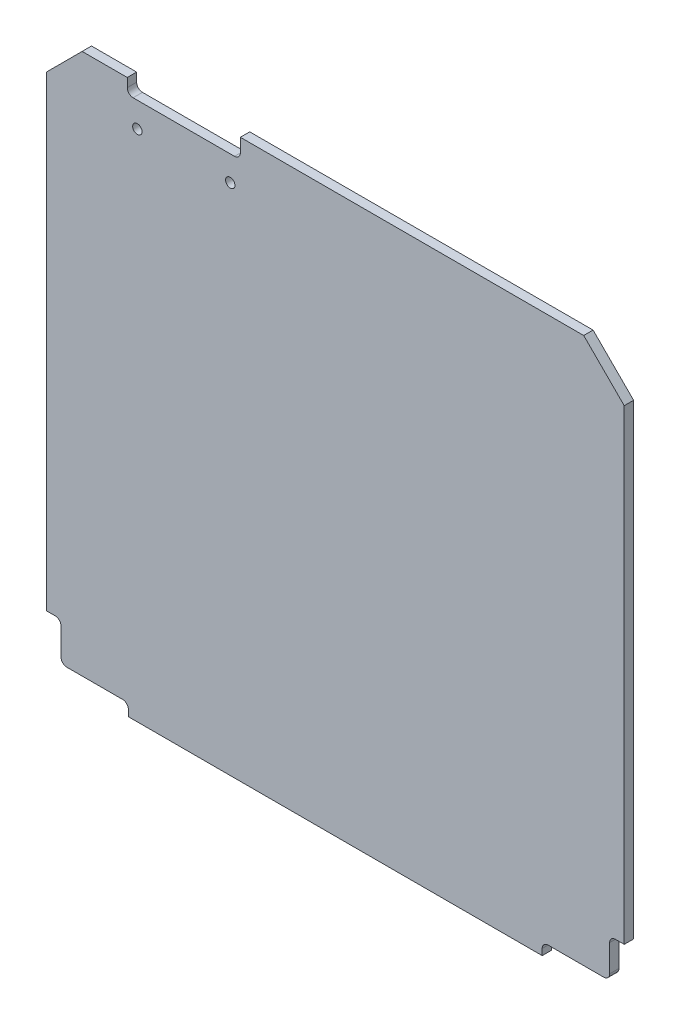
ISO-10303-21;
HEADER;
FILE_DESCRIPTION(('STEP AP214'),'2;1');
FILE_NAME('part.step','',(''),(''),'','','');
FILE_SCHEMA(('AUTOMOTIVE_DESIGN { 1 0 10303 214 1 1 1 1 }'));
ENDSEC;
DATA;
#1=APPLICATION_CONTEXT('core data for automotive mechanical design processes');
#2=APPLICATION_PROTOCOL_DEFINITION('international standard','automotive_design',2000,#1);
#3=PRODUCT_CONTEXT('',#1,'mechanical');
#4=PRODUCT('Part','Part','',(#3));
#5=PRODUCT_RELATED_PRODUCT_CATEGORY('part','',(#4));
#6=PRODUCT_DEFINITION_FORMATION('','',#4);
#7=PRODUCT_DEFINITION_CONTEXT('part definition',#1,'design');
#8=PRODUCT_DEFINITION('design','',#6,#7);
#9=PRODUCT_DEFINITION_SHAPE('','',#8);
#10=(LENGTH_UNIT() NAMED_UNIT(*) SI_UNIT(.MILLI.,.METRE.));
#11=(NAMED_UNIT(*) PLANE_ANGLE_UNIT() SI_UNIT($,.RADIAN.));
#12=(NAMED_UNIT(*) SI_UNIT($,.STERADIAN.) SOLID_ANGLE_UNIT());
#13=UNCERTAINTY_MEASURE_WITH_UNIT(LENGTH_MEASURE(1.E-05),#10,'distance_accuracy_value','');
#14=(GEOMETRIC_REPRESENTATION_CONTEXT(3) GLOBAL_UNCERTAINTY_ASSIGNED_CONTEXT((#13)) GLOBAL_UNIT_ASSIGNED_CONTEXT((#10,
#11,#12)) REPRESENTATION_CONTEXT('',''));
#15=CARTESIAN_POINT('',(0.,0.,0.));
#16=DIRECTION('',(0.,0.,1.));
#17=DIRECTION('',(1.,0.,0.));
#18=AXIS2_PLACEMENT_3D('',#15,#16,#17);
#19=CARTESIAN_POINT('',(-36.3,-48.0000000000001,-0.0125000000000027));
#20=DIRECTION('',(0.,0.,1.));
#21=DIRECTION('',(1.,0.,0.));
#22=AXIS2_PLACEMENT_3D('',#19,#20,#21);
#23=CYLINDRICAL_SURFACE('',#22,1.00000000000001);
#24=CARTESIAN_POINT('',(-36.3,-48.0000000000001,1.5875));
#25=DIRECTION('',(0.,0.,-1.));
#26=DIRECTION('',(-1.,0.,0.));
#27=AXIS2_PLACEMENT_3D('',#24,#25,#26);
#28=CIRCLE('',#27,1.00000000000001);
#29=CARTESIAN_POINT('',(-36.3,-47.0000000000001,1.5875));
#30=VERTEX_POINT('',#29);
#31=CARTESIAN_POINT('',(-35.3,-48.0000000000001,1.5875));
#32=VERTEX_POINT('',#31);
#33=EDGE_CURVE('E238',#30,#32,#28,.T.);
#34=ORIENTED_EDGE('',*,*,#33,.F.);
#35=DIRECTION('',(0.,0.,1.));
#36=VECTOR('',#35,1.);
#37=CARTESIAN_POINT('',(-36.3,-47.0000000000001,-0.0125000000000027));
#38=LINE('',#37,#36);
#39=CARTESIAN_POINT('',(-36.3,-47.0000000000001,-0.0125000000000027));
#40=VERTEX_POINT('',#39);
#41=EDGE_CURVE('E11',#40,#30,#38,.T.);
#42=ORIENTED_EDGE('',*,*,#41,.F.);
#43=CARTESIAN_POINT('',(-36.3,-48.0000000000001,-0.0125000000000027));
#44=DIRECTION('',(0.,0.,-1.));
#45=DIRECTION('',(-1.,0.,0.));
#46=AXIS2_PLACEMENT_3D('',#43,#44,#45);
#47=CIRCLE('',#46,1.00000000000001);
#48=CARTESIAN_POINT('',(-35.3,-48.0000000000001,-0.0125000000000027));
#49=VERTEX_POINT('',#48);
#50=EDGE_CURVE('E313',#40,#49,#47,.T.);
#51=ORIENTED_EDGE('',*,*,#50,.T.);
#52=DIRECTION('',(0.,0.,1.));
#53=VECTOR('',#52,1.);
#54=CARTESIAN_POINT('',(-35.3,-48.0000000000001,-0.0125000000000027));
#55=LINE('',#54,#53);
#56=EDGE_CURVE('E36',#49,#32,#55,.T.);
#57=ORIENTED_EDGE('',*,*,#56,.T.);
#58=EDGE_LOOP('',(#34,#42,#51,#57));
#59=FACE_BOUND('',#58,.T.);
#60=ADVANCED_FACE('F33',(#59),#23,.F.);
#61=CARTESIAN_POINT('',(-45.7999999999992,-47.,-0.0125000000000027));
#62=DIRECTION('',(0.,-1.,0.));
#63=DIRECTION('',(1.,0.,0.));
#64=AXIS2_PLACEMENT_3D('',#61,#62,#63);
#65=PLANE('',#64);
#66=DIRECTION('',(1.,0.,0.));
#67=VECTOR('',#66,1.);
#68=CARTESIAN_POINT('',(-45.7999999999992,-47.,1.5875));
#69=LINE('',#68,#67);
#70=CARTESIAN_POINT('',(-45.7999999999992,-47.,1.5875));
#71=VERTEX_POINT('',#70);
#72=EDGE_CURVE('E311',#71,#30,#69,.T.);
#73=ORIENTED_EDGE('',*,*,#72,.F.);
#74=DIRECTION('',(0.,0.,1.));
#75=VECTOR('',#74,1.);
#76=CARTESIAN_POINT('',(-45.7999999999992,-47.,-0.0125000000000027));
#77=LINE('',#76,#75);
#78=CARTESIAN_POINT('',(-45.7999999999992,-47.,-0.0125000000000027));
#79=VERTEX_POINT('',#78);
#80=EDGE_CURVE('E42',#79,#71,#77,.T.);
#81=ORIENTED_EDGE('',*,*,#80,.F.);
#82=DIRECTION('',(1.,0.,0.));
#83=VECTOR('',#82,1.);
#84=CARTESIAN_POINT('',(-45.7999999999992,-47.,-0.0125000000000027));
#85=LINE('',#84,#83);
#86=EDGE_CURVE('E228',#79,#40,#85,.T.);
#87=ORIENTED_EDGE('',*,*,#86,.T.);
#88=ORIENTED_EDGE('',*,*,#41,.T.);
#89=EDGE_LOOP('',(#73,#81,#87,#88));
#90=FACE_BOUND('',#89,.T.);
#91=ADVANCED_FACE('F361',(#90),#65,.T.);
#92=CARTESIAN_POINT('',(-45.7999999999992,-46.0000000000001,-0.0125000000000027));
#93=DIRECTION('',(0.,0.,1.));
#94=DIRECTION('',(1.,0.,0.));
#95=AXIS2_PLACEMENT_3D('',#92,#93,#94);
#96=CYLINDRICAL_SURFACE('',#95,0.999999999999959);
#97=CARTESIAN_POINT('',(-45.7999999999992,-46.0000000000001,1.5875));
#98=DIRECTION('',(0.,0.,1.));
#99=DIRECTION('',(1.,0.,0.));
#100=AXIS2_PLACEMENT_3D('',#97,#98,#99);
#101=CIRCLE('',#100,0.999999999999959);
#102=CARTESIAN_POINT('',(-46.7999999999992,-46.0000000000001,1.5875));
#103=VERTEX_POINT('',#102);
#104=EDGE_CURVE('E215',#103,#71,#101,.T.);
#105=ORIENTED_EDGE('',*,*,#104,.F.);
#106=DIRECTION('',(0.,0.,1.));
#107=VECTOR('',#106,1.);
#108=CARTESIAN_POINT('',(-46.7999999999992,-46.0000000000001,-0.0125000000000027));
#109=LINE('',#108,#107);
#110=CARTESIAN_POINT('',(-46.7999999999992,-46.0000000000001,-0.0125000000000027));
#111=VERTEX_POINT('',#110);
#112=EDGE_CURVE('E210',#111,#103,#109,.T.);
#113=ORIENTED_EDGE('',*,*,#112,.F.);
#114=CARTESIAN_POINT('',(-45.7999999999992,-46.0000000000001,-0.0125000000000027));
#115=DIRECTION('',(0.,0.,1.));
#116=DIRECTION('',(1.,0.,0.));
#117=AXIS2_PLACEMENT_3D('',#114,#115,#116);
#118=CIRCLE('',#117,0.999999999999959);
#119=EDGE_CURVE('E213',#111,#79,#118,.T.);
#120=ORIENTED_EDGE('',*,*,#119,.T.);
#121=ORIENTED_EDGE('',*,*,#80,.T.);
#122=EDGE_LOOP('',(#105,#113,#120,#121));
#123=FACE_BOUND('',#122,.T.);
#124=ADVANCED_FACE('F212',(#123),#96,.T.);
#125=CARTESIAN_POINT('',(-46.7999999999992,-41.400000000001,-0.0125000000000027));
#126=DIRECTION('',(-1.,0.,0.));
#127=DIRECTION('',(0.,0.,1.));
#128=AXIS2_PLACEMENT_3D('',#125,#126,#127);
#129=PLANE('',#128);
#130=DIRECTION('',(0.,-1.,0.));
#131=VECTOR('',#130,1.);
#132=CARTESIAN_POINT('',(-46.7999999999992,-41.400000000001,1.5875));
#133=LINE('',#132,#131);
#134=CARTESIAN_POINT('',(-46.7999999999992,-41.400000000001,1.5875));
#135=VERTEX_POINT('',#134);
#136=EDGE_CURVE('E308',#135,#103,#133,.T.);
#137=ORIENTED_EDGE('',*,*,#136,.F.);
#138=DIRECTION('',(0.,0.,1.));
#139=VECTOR('',#138,1.);
#140=CARTESIAN_POINT('',(-46.7999999999992,-41.400000000001,-0.0125000000000027));
#141=LINE('',#140,#139);
#142=CARTESIAN_POINT('',(-46.7999999999992,-41.400000000001,-0.0125000000000027));
#143=VERTEX_POINT('',#142);
#144=EDGE_CURVE('E220',#143,#135,#141,.T.);
#145=ORIENTED_EDGE('',*,*,#144,.F.);
#146=DIRECTION('',(0.,-1.,0.));
#147=VECTOR('',#146,1.);
#148=CARTESIAN_POINT('',(-46.7999999999992,-41.400000000001,-0.0125000000000027));
#149=LINE('',#148,#147);
#150=EDGE_CURVE('E226',#143,#111,#149,.T.);
#151=ORIENTED_EDGE('',*,*,#150,.T.);
#152=ORIENTED_EDGE('',*,*,#112,.T.);
#153=EDGE_LOOP('',(#137,#145,#151,#152));
#154=FACE_BOUND('',#153,.T.);
#155=ADVANCED_FACE('F230',(#154),#129,.T.);
#156=CARTESIAN_POINT('',(-47.7999999999992,-41.400000000001,-0.0125000000000027));
#157=DIRECTION('',(0.,0.,1.));
#158=DIRECTION('',(1.,0.,0.));
#159=AXIS2_PLACEMENT_3D('',#156,#157,#158);
#160=CYLINDRICAL_SURFACE('',#159,0.999999999999997);
#161=CARTESIAN_POINT('',(-47.7999999999992,-41.400000000001,1.5875));
#162=DIRECTION('',(0.,0.,-1.));
#163=DIRECTION('',(-1.,0.,0.));
#164=AXIS2_PLACEMENT_3D('',#161,#162,#163);
#165=CIRCLE('',#164,0.999999999999997);
#166=CARTESIAN_POINT('',(-47.7999999999992,-40.400000000001,1.5875));
#167=VERTEX_POINT('',#166);
#168=EDGE_CURVE('E305',#167,#135,#165,.T.);
#169=ORIENTED_EDGE('',*,*,#168,.F.);
#170=DIRECTION('',(0.,0.,1.));
#171=VECTOR('',#170,1.);
#172=CARTESIAN_POINT('',(-47.7999999999992,-40.400000000001,-0.0125000000000027));
#173=LINE('',#172,#171);
#174=CARTESIAN_POINT('',(-47.7999999999992,-40.400000000001,-0.0125000000000027));
#175=VERTEX_POINT('',#174);
#176=EDGE_CURVE('E317',#175,#167,#173,.T.);
#177=ORIENTED_EDGE('',*,*,#176,.F.);
#178=CARTESIAN_POINT('',(-47.7999999999992,-41.400000000001,-0.0125000000000027));
#179=DIRECTION('',(0.,0.,-1.));
#180=DIRECTION('',(-1.,0.,0.));
#181=AXIS2_PLACEMENT_3D('',#178,#179,#180);
#182=CIRCLE('',#181,0.999999999999997);
#183=EDGE_CURVE('E231',#175,#143,#182,.T.);
#184=ORIENTED_EDGE('',*,*,#183,.T.);
#185=ORIENTED_EDGE('',*,*,#144,.T.);
#186=EDGE_LOOP('',(#169,#177,#184,#185));
#187=FACE_BOUND('',#186,.T.);
#188=ADVANCED_FACE('F374',(#187),#160,.F.);
#189=CARTESIAN_POINT('',(-49.3000000000002,-40.400000000001,-0.0125000000000027));
#190=DIRECTION('',(0.,-1.,0.));
#191=DIRECTION('',(1.,0.,0.));
#192=AXIS2_PLACEMENT_3D('',#189,#190,#191);
#193=PLANE('',#192);
#194=DIRECTION('',(1.,0.,0.));
#195=VECTOR('',#194,1.);
#196=CARTESIAN_POINT('',(-49.3000000000002,-40.400000000001,1.5875));
#197=LINE('',#196,#195);
#198=CARTESIAN_POINT('',(-49.3000000000002,-40.400000000001,1.5875));
#199=VERTEX_POINT('',#198);
#200=EDGE_CURVE('E302',#199,#167,#197,.T.);
#201=ORIENTED_EDGE('',*,*,#200,.F.);
#202=DIRECTION('',(0.,0.,1.));
#203=VECTOR('',#202,1.);
#204=CARTESIAN_POINT('',(-49.3000000000002,-40.400000000001,-0.0125000000000027));
#205=LINE('',#204,#203);
#206=CARTESIAN_POINT('',(-49.3000000000002,-40.400000000001,-0.0125000000000027));
#207=VERTEX_POINT('',#206);
#208=EDGE_CURVE('E319',#207,#199,#205,.T.);
#209=ORIENTED_EDGE('',*,*,#208,.F.);
#210=DIRECTION('',(1.,0.,0.));
#211=VECTOR('',#210,1.);
#212=CARTESIAN_POINT('',(-49.3000000000002,-40.400000000001,-0.0125000000000027));
#213=LINE('',#212,#211);
#214=EDGE_CURVE('E233',#207,#175,#213,.T.);
#215=ORIENTED_EDGE('',*,*,#214,.T.);
#216=ORIENTED_EDGE('',*,*,#176,.T.);
#217=EDGE_LOOP('',(#201,#209,#215,#216));
#218=FACE_BOUND('',#217,.T.);
#219=ADVANCED_FACE('F377',(#218),#193,.T.);
#220=CARTESIAN_POINT('',(-49.3,39.2000000000024,-0.0125000000000027));
#221=DIRECTION('',(-1.,0.,0.));
#222=DIRECTION('',(0.,-1.,0.));
#223=AXIS2_PLACEMENT_3D('',#220,#221,#222);
#224=PLANE('',#223);
#225=DIRECTION('',(0.,-1.,0.));
#226=VECTOR('',#225,1.);
#227=CARTESIAN_POINT('',(-49.3,39.2000000000024,1.5875));
#228=LINE('',#227,#226);
#229=CARTESIAN_POINT('',(-49.3,39.2000000000024,1.5875));
#230=VERTEX_POINT('',#229);
#231=EDGE_CURVE('E299',#230,#199,#228,.T.);
#232=ORIENTED_EDGE('',*,*,#231,.F.);
#233=DIRECTION('',(0.,0.,1.));
#234=VECTOR('',#233,1.);
#235=CARTESIAN_POINT('',(-49.3,39.2000000000024,-0.0125000000000027));
#236=LINE('',#235,#234);
#237=CARTESIAN_POINT('',(-49.3,39.2000000000024,-0.0125000000000027));
#238=VERTEX_POINT('',#237);
#239=EDGE_CURVE('E321',#238,#230,#236,.T.);
#240=ORIENTED_EDGE('',*,*,#239,.F.);
#241=DIRECTION('',(0.,-1.,0.));
#242=VECTOR('',#241,1.);
#243=CARTESIAN_POINT('',(-49.3,39.2000000000024,-0.0125000000000027));
#244=LINE('',#243,#242);
#245=EDGE_CURVE('E549',#238,#207,#244,.T.);
#246=ORIENTED_EDGE('',*,*,#245,.T.);
#247=ORIENTED_EDGE('',*,*,#208,.T.);
#248=EDGE_LOOP('',(#232,#240,#246,#247));
#249=FACE_BOUND('',#248,.T.);
#250=ADVANCED_FACE('F381',(#249),#224,.T.);
#251=CARTESIAN_POINT('',(-43.2000000000015,45.3000000000009,-0.0125000000000027));
#252=DIRECTION('',(-0.707106781186551,0.707106781186544,0.));
#253=DIRECTION('',(-0.707106781186544,-0.707106781186551,0.));
#254=AXIS2_PLACEMENT_3D('',#251,#252,#253);
#255=PLANE('',#254);
#256=DIRECTION('',(-0.707106781186544,-0.707106781186551,0.));
#257=VECTOR('',#256,1.);
#258=CARTESIAN_POINT('',(-43.2000000000015,45.3000000000009,1.5875));
#259=LINE('',#258,#257);
#260=CARTESIAN_POINT('',(-43.2000000000015,45.3000000000009,1.5875));
#261=VERTEX_POINT('',#260);
#262=EDGE_CURVE('E296',#261,#230,#259,.T.);
#263=ORIENTED_EDGE('',*,*,#262,.F.);
#264=DIRECTION('',(0.,0.,1.));
#265=VECTOR('',#264,1.);
#266=CARTESIAN_POINT('',(-43.2000000000015,45.3000000000009,-0.0125000000000027));
#267=LINE('',#266,#265);
#268=CARTESIAN_POINT('',(-43.2000000000015,45.3000000000009,-0.0125000000000027));
#269=VERTEX_POINT('',#268);
#270=EDGE_CURVE('E323',#269,#261,#267,.T.);
#271=ORIENTED_EDGE('',*,*,#270,.F.);
#272=DIRECTION('',(-0.707106781186544,-0.707106781186551,0.));
#273=VECTOR('',#272,1.);
#274=CARTESIAN_POINT('',(-43.2000000000015,45.3000000000009,-0.0125000000000027));
#275=LINE('',#274,#273);
#276=EDGE_CURVE('E546',#269,#238,#275,.T.);
#277=ORIENTED_EDGE('',*,*,#276,.T.);
#278=ORIENTED_EDGE('',*,*,#239,.T.);
#279=EDGE_LOOP('',(#263,#271,#277,#278));
#280=FACE_BOUND('',#279,.T.);
#281=ADVANCED_FACE('F385',(#280),#255,.T.);
#282=CARTESIAN_POINT('',(-35.5000000173737,45.3000000000009,-0.0125000000000027));
#283=DIRECTION('',(0.,1.,0.));
#284=DIRECTION('',(0.,0.,1.));
#285=AXIS2_PLACEMENT_3D('',#282,#283,#284);
#286=PLANE('',#285);
#287=DIRECTION('',(-1.,0.,0.));
#288=VECTOR('',#287,1.);
#289=CARTESIAN_POINT('',(-35.5000000173737,45.3000000000009,1.5875));
#290=LINE('',#289,#288);
#291=CARTESIAN_POINT('',(-35.5000000173737,45.3000000000009,1.5875));
#292=VERTEX_POINT('',#291);
#293=EDGE_CURVE('E293',#292,#261,#290,.T.);
#294=ORIENTED_EDGE('',*,*,#293,.F.);
#295=DIRECTION('',(0.,0.,1.));
#296=VECTOR('',#295,1.);
#297=CARTESIAN_POINT('',(-35.5000000173737,45.3000000000009,-0.0125000000000027));
#298=LINE('',#297,#296);
#299=CARTESIAN_POINT('',(-35.5000000173737,45.3000000000009,-0.0125000000000027));
#300=VERTEX_POINT('',#299);
#301=EDGE_CURVE('E325',#300,#292,#298,.T.);
#302=ORIENTED_EDGE('',*,*,#301,.F.);
#303=DIRECTION('',(-1.,0.,0.));
#304=VECTOR('',#303,1.);
#305=CARTESIAN_POINT('',(-35.5000000173737,45.3000000000009,-0.0125000000000027));
#306=LINE('',#305,#304);
#307=EDGE_CURVE('E543',#300,#269,#306,.T.);
#308=ORIENTED_EDGE('',*,*,#307,.T.);
#309=ORIENTED_EDGE('',*,*,#270,.T.);
#310=EDGE_LOOP('',(#294,#302,#308,#309));
#311=FACE_BOUND('',#310,.T.);
#312=ADVANCED_FACE('F389',(#311),#286,.T.);
#313=CARTESIAN_POINT('',(-35.5000000173737,43.8000000000008,-0.0125000000000027));
#314=DIRECTION('',(1.,0.,0.));
#315=DIRECTION('',(0.,1.,0.));
#316=AXIS2_PLACEMENT_3D('',#313,#314,#315);
#317=PLANE('',#316);
#318=DIRECTION('',(0.,1.,0.));
#319=VECTOR('',#318,1.);
#320=CARTESIAN_POINT('',(-35.5000000173737,43.8000000000008,1.5875));
#321=LINE('',#320,#319);
#322=CARTESIAN_POINT('',(-35.5000000173737,43.8000000000008,1.5875));
#323=VERTEX_POINT('',#322);
#324=EDGE_CURVE('E290',#323,#292,#321,.T.);
#325=ORIENTED_EDGE('',*,*,#324,.F.);
#326=DIRECTION('',(0.,0.,1.));
#327=VECTOR('',#326,1.);
#328=CARTESIAN_POINT('',(-35.5000000173737,43.8000000000008,-0.0125000000000027));
#329=LINE('',#328,#327);
#330=CARTESIAN_POINT('',(-35.5000000173737,43.8000000000008,-0.0125000000000027));
#331=VERTEX_POINT('',#330);
#332=EDGE_CURVE('E327',#331,#323,#329,.T.);
#333=ORIENTED_EDGE('',*,*,#332,.F.);
#334=DIRECTION('',(0.,1.,0.));
#335=VECTOR('',#334,1.);
#336=CARTESIAN_POINT('',(-35.5000000173737,43.8000000000008,-0.0125000000000027));
#337=LINE('',#336,#335);
#338=EDGE_CURVE('E540',#331,#300,#337,.T.);
#339=ORIENTED_EDGE('',*,*,#338,.T.);
#340=ORIENTED_EDGE('',*,*,#301,.T.);
#341=EDGE_LOOP('',(#325,#333,#339,#340));
#342=FACE_BOUND('',#341,.T.);
#343=ADVANCED_FACE('F393',(#342),#317,.T.);
#344=CARTESIAN_POINT('',(-34.5000000173737,43.8000000000008,-0.0125000000000027));
#345=DIRECTION('',(0.,0.,1.));
#346=DIRECTION('',(1.,0.,0.));
#347=AXIS2_PLACEMENT_3D('',#344,#345,#346);
#348=CYLINDRICAL_SURFACE('',#347,0.999999999999984);
#349=CARTESIAN_POINT('',(-34.5000000173737,43.8000000000008,1.5875));
#350=DIRECTION('',(0.,0.,-1.));
#351=DIRECTION('',(-1.,0.,0.));
#352=AXIS2_PLACEMENT_3D('',#349,#350,#351);
#353=CIRCLE('',#352,0.999999999999984);
#354=CARTESIAN_POINT('',(-34.5000000173737,42.8000000000008,1.5875));
#355=VERTEX_POINT('',#354);
#356=EDGE_CURVE('E287',#355,#323,#353,.T.);
#357=ORIENTED_EDGE('',*,*,#356,.F.);
#358=DIRECTION('',(0.,0.,1.));
#359=VECTOR('',#358,1.);
#360=CARTESIAN_POINT('',(-34.5000000173737,42.8000000000008,-0.0125000000000027));
#361=LINE('',#360,#359);
#362=CARTESIAN_POINT('',(-34.5000000173737,42.8000000000008,-0.0125000000000027));
#363=VERTEX_POINT('',#362);
#364=EDGE_CURVE('E329',#363,#355,#361,.T.);
#365=ORIENTED_EDGE('',*,*,#364,.F.);
#366=CARTESIAN_POINT('',(-34.5000000173737,43.8000000000008,-0.0125000000000027));
#367=DIRECTION('',(0.,0.,-1.));
#368=DIRECTION('',(-1.,0.,0.));
#369=AXIS2_PLACEMENT_3D('',#366,#367,#368);
#370=CIRCLE('',#369,0.999999999999984);
#371=EDGE_CURVE('E537',#363,#331,#370,.T.);
#372=ORIENTED_EDGE('',*,*,#371,.T.);
#373=ORIENTED_EDGE('',*,*,#332,.T.);
#374=EDGE_LOOP('',(#357,#365,#372,#373));
#375=FACE_BOUND('',#374,.T.);
#376=ADVANCED_FACE('F397',(#375),#348,.F.);
#377=CARTESIAN_POINT('',(-17.2000000086743,42.8000000000008,-0.0125000000000027));
#378=DIRECTION('',(0.,1.,0.));
#379=DIRECTION('',(-1.,0.,0.));
#380=AXIS2_PLACEMENT_3D('',#377,#378,#379);
#381=PLANE('',#380);
#382=DIRECTION('',(-1.,0.,0.));
#383=VECTOR('',#382,1.);
#384=CARTESIAN_POINT('',(-17.2000000086743,42.8000000000008,1.5875));
#385=LINE('',#384,#383);
#386=CARTESIAN_POINT('',(-17.2000000086743,42.8000000000008,1.5875));
#387=VERTEX_POINT('',#386);
#388=EDGE_CURVE('E284',#387,#355,#385,.T.);
#389=ORIENTED_EDGE('',*,*,#388,.F.);
#390=DIRECTION('',(0.,0.,1.));
#391=VECTOR('',#390,1.);
#392=CARTESIAN_POINT('',(-17.2000000086743,42.8000000000008,-0.0125000000000027));
#393=LINE('',#392,#391);
#394=CARTESIAN_POINT('',(-17.2000000086743,42.8000000000008,-0.0125000000000027));
#395=VERTEX_POINT('',#394);
#396=EDGE_CURVE('E331',#395,#387,#393,.T.);
#397=ORIENTED_EDGE('',*,*,#396,.F.);
#398=DIRECTION('',(-1.,0.,0.));
#399=VECTOR('',#398,1.);
#400=CARTESIAN_POINT('',(-17.2000000086743,42.8000000000008,-0.0125000000000027));
#401=LINE('',#400,#399);
#402=EDGE_CURVE('E534',#395,#363,#401,.T.);
#403=ORIENTED_EDGE('',*,*,#402,.T.);
#404=ORIENTED_EDGE('',*,*,#364,.T.);
#405=EDGE_LOOP('',(#389,#397,#403,#404));
#406=FACE_BOUND('',#405,.T.);
#407=ADVANCED_FACE('F401',(#406),#381,.T.);
#408=CARTESIAN_POINT('',(-17.2000000086743,43.8000000000008,-0.0125000000000027));
#409=DIRECTION('',(0.,0.,1.));
#410=DIRECTION('',(1.,0.,0.));
#411=AXIS2_PLACEMENT_3D('',#408,#409,#410);
#412=CYLINDRICAL_SURFACE('',#411,0.999999999999992);
#413=CARTESIAN_POINT('',(-17.2000000086743,43.8000000000008,1.5875));
#414=DIRECTION('',(0.,0.,-1.));
#415=DIRECTION('',(-1.,0.,0.));
#416=AXIS2_PLACEMENT_3D('',#413,#414,#415);
#417=CIRCLE('',#416,0.999999999999992);
#418=CARTESIAN_POINT('',(-16.2000000086743,43.8000000000008,1.5875));
#419=VERTEX_POINT('',#418);
#420=EDGE_CURVE('E281',#419,#387,#417,.T.);
#421=ORIENTED_EDGE('',*,*,#420,.F.);
#422=DIRECTION('',(0.,0.,1.));
#423=VECTOR('',#422,1.);
#424=CARTESIAN_POINT('',(-16.2000000086743,43.8000000000008,-0.0125000000000027));
#425=LINE('',#424,#423);
#426=CARTESIAN_POINT('',(-16.2000000086743,43.8000000000008,-0.0125000000000027));
#427=VERTEX_POINT('',#426);
#428=EDGE_CURVE('E333',#427,#419,#425,.T.);
#429=ORIENTED_EDGE('',*,*,#428,.F.);
#430=CARTESIAN_POINT('',(-17.2000000086743,43.8000000000008,-0.0125000000000027));
#431=DIRECTION('',(0.,0.,-1.));
#432=DIRECTION('',(-1.,0.,0.));
#433=AXIS2_PLACEMENT_3D('',#430,#431,#432);
#434=CIRCLE('',#433,0.999999999999992);
#435=EDGE_CURVE('E531',#427,#395,#434,.T.);
#436=ORIENTED_EDGE('',*,*,#435,.T.);
#437=ORIENTED_EDGE('',*,*,#396,.T.);
#438=EDGE_LOOP('',(#421,#429,#436,#437));
#439=FACE_BOUND('',#438,.T.);
#440=ADVANCED_FACE('F405',(#439),#412,.F.);
#441=CARTESIAN_POINT('',(-16.2000000086743,46.1149999999993,-0.0125000000000027));
#442=DIRECTION('',(-1.,0.,0.));
#443=DIRECTION('',(0.,-1.,0.));
#444=AXIS2_PLACEMENT_3D('',#441,#442,#443);
#445=PLANE('',#444);
#446=DIRECTION('',(0.,-1.,0.));
#447=VECTOR('',#446,1.);
#448=CARTESIAN_POINT('',(-16.2000000086743,46.1149999999993,1.5875));
#449=LINE('',#448,#447);
#450=CARTESIAN_POINT('',(-16.2000000086743,46.1149999999993,1.5875));
#451=VERTEX_POINT('',#450);
#452=EDGE_CURVE('E278',#451,#419,#449,.T.);
#453=ORIENTED_EDGE('',*,*,#452,.F.);
#454=DIRECTION('',(0.,0.,1.));
#455=VECTOR('',#454,1.);
#456=CARTESIAN_POINT('',(-16.2000000086743,46.1149999999993,-0.0125000000000027));
#457=LINE('',#456,#455);
#458=CARTESIAN_POINT('',(-16.2000000086743,46.1149999999993,-0.0125000000000027));
#459=VERTEX_POINT('',#458);
#460=EDGE_CURVE('E335',#459,#451,#457,.T.);
#461=ORIENTED_EDGE('',*,*,#460,.F.);
#462=DIRECTION('',(0.,-1.,0.));
#463=VECTOR('',#462,1.);
#464=CARTESIAN_POINT('',(-16.2000000086743,46.1149999999993,-0.0125000000000027));
#465=LINE('',#464,#463);
#466=EDGE_CURVE('E528',#459,#427,#465,.T.);
#467=ORIENTED_EDGE('',*,*,#466,.T.);
#468=ORIENTED_EDGE('',*,*,#428,.T.);
#469=EDGE_LOOP('',(#453,#461,#467,#468));
#470=FACE_BOUND('',#469,.T.);
#471=ADVANCED_FACE('F409',(#470),#445,.T.);
#472=CARTESIAN_POINT('',(42.3850000000029,46.1149999999991,-0.0125000000000027));
#473=DIRECTION('',(0.,1.,0.));
#474=DIRECTION('',(-1.,0.,0.));
#475=AXIS2_PLACEMENT_3D('',#472,#473,#474);
#476=PLANE('',#475);
#477=DIRECTION('',(-1.,0.,0.));
#478=VECTOR('',#477,1.);
#479=CARTESIAN_POINT('',(42.3850000000029,46.1149999999991,1.5875));
#480=LINE('',#479,#478);
#481=CARTESIAN_POINT('',(42.3850000000029,46.1149999999991,1.5875));
#482=VERTEX_POINT('',#481);
#483=EDGE_CURVE('E275',#482,#451,#480,.T.);
#484=ORIENTED_EDGE('',*,*,#483,.F.);
#485=DIRECTION('',(0.,0.,1.));
#486=VECTOR('',#485,1.);
#487=CARTESIAN_POINT('',(42.3850000000029,46.1149999999991,-0.0125000000000027));
#488=LINE('',#487,#486);
#489=CARTESIAN_POINT('',(42.3850000000029,46.1149999999991,-0.0125000000000027));
#490=VERTEX_POINT('',#489);
#491=EDGE_CURVE('E337',#490,#482,#488,.T.);
#492=ORIENTED_EDGE('',*,*,#491,.F.);
#493=DIRECTION('',(-1.,0.,0.));
#494=VECTOR('',#493,1.);
#495=CARTESIAN_POINT('',(42.3850000000029,46.1149999999991,-0.0125000000000027));
#496=LINE('',#495,#494);
#497=EDGE_CURVE('E525',#490,#459,#496,.T.);
#498=ORIENTED_EDGE('',*,*,#497,.T.);
#499=ORIENTED_EDGE('',*,*,#460,.T.);
#500=EDGE_LOOP('',(#484,#492,#498,#499));
#501=FACE_BOUND('',#500,.T.);
#502=ADVANCED_FACE('F413',(#501),#476,.T.);
#503=CARTESIAN_POINT('',(49.3,39.200000000002,-0.0125000000000027));
#504=DIRECTION('',(0.707106781186547,0.707106781186547,0.));
#505=DIRECTION('',(-0.707106781186548,0.707106781186548,0.));
#506=AXIS2_PLACEMENT_3D('',#503,#504,#505);
#507=PLANE('',#506);
#508=DIRECTION('',(-0.707106781186548,0.707106781186548,0.));
#509=VECTOR('',#508,1.);
#510=CARTESIAN_POINT('',(49.3,39.200000000002,1.5875));
#511=LINE('',#510,#509);
#512=CARTESIAN_POINT('',(49.3,39.200000000002,1.5875));
#513=VERTEX_POINT('',#512);
#514=EDGE_CURVE('E272',#513,#482,#511,.T.);
#515=ORIENTED_EDGE('',*,*,#514,.F.);
#516=DIRECTION('',(0.,0.,1.));
#517=VECTOR('',#516,1.);
#518=CARTESIAN_POINT('',(49.3,39.200000000002,-0.0125000000000027));
#519=LINE('',#518,#517);
#520=CARTESIAN_POINT('',(49.3,39.200000000002,-0.0125000000000027));
#521=VERTEX_POINT('',#520);
#522=EDGE_CURVE('E339',#521,#513,#519,.T.);
#523=ORIENTED_EDGE('',*,*,#522,.F.);
#524=DIRECTION('',(-0.707106781186548,0.707106781186548,0.));
#525=VECTOR('',#524,1.);
#526=CARTESIAN_POINT('',(49.3,39.200000000002,-0.0125000000000027));
#527=LINE('',#526,#525);
#528=EDGE_CURVE('E522',#521,#490,#527,.T.);
#529=ORIENTED_EDGE('',*,*,#528,.T.);
#530=ORIENTED_EDGE('',*,*,#491,.T.);
#531=EDGE_LOOP('',(#515,#523,#529,#530));
#532=FACE_BOUND('',#531,.T.);
#533=ADVANCED_FACE('F417',(#532),#507,.T.);
#534=CARTESIAN_POINT('',(49.3,-40.400000000001,-0.0125000000000027));
#535=DIRECTION('',(1.,0.,0.));
#536=DIRECTION('',(0.,1.,0.));
#537=AXIS2_PLACEMENT_3D('',#534,#535,#536);
#538=PLANE('',#537);
#539=DIRECTION('',(0.,1.,0.));
#540=VECTOR('',#539,1.);
#541=CARTESIAN_POINT('',(49.3,-40.400000000001,1.5875));
#542=LINE('',#541,#540);
#543=CARTESIAN_POINT('',(49.3,-40.400000000001,1.5875));
#544=VERTEX_POINT('',#543);
#545=EDGE_CURVE('E269',#544,#513,#542,.T.);
#546=ORIENTED_EDGE('',*,*,#545,.F.);
#547=DIRECTION('',(0.,0.,1.));
#548=VECTOR('',#547,1.);
#549=CARTESIAN_POINT('',(49.3,-40.400000000001,-0.0125000000000027));
#550=LINE('',#549,#548);
#551=CARTESIAN_POINT('',(49.3,-40.400000000001,-0.0125000000000027));
#552=VERTEX_POINT('',#551);
#553=EDGE_CURVE('E341',#552,#544,#550,.T.);
#554=ORIENTED_EDGE('',*,*,#553,.F.);
#555=DIRECTION('',(0.,1.,0.));
#556=VECTOR('',#555,1.);
#557=CARTESIAN_POINT('',(49.3,-40.400000000001,-0.0125000000000027));
#558=LINE('',#557,#556);
#559=EDGE_CURVE('E519',#552,#521,#558,.T.);
#560=ORIENTED_EDGE('',*,*,#559,.T.);
#561=ORIENTED_EDGE('',*,*,#522,.T.);
#562=EDGE_LOOP('',(#546,#554,#560,#561));
#563=FACE_BOUND('',#562,.T.);
#564=ADVANCED_FACE('F421',(#563),#538,.T.);
#565=CARTESIAN_POINT('',(47.7999999999989,-40.400000000001,-0.0125000000000027));
#566=DIRECTION('',(0.,-1.,0.));
#567=DIRECTION('',(0.,0.,-1.));
#568=AXIS2_PLACEMENT_3D('',#565,#566,#567);
#569=PLANE('',#568);
#570=DIRECTION('',(1.,0.,0.));
#571=VECTOR('',#570,1.);
#572=CARTESIAN_POINT('',(47.7999999999989,-40.400000000001,1.5875));
#573=LINE('',#572,#571);
#574=CARTESIAN_POINT('',(47.7999999999989,-40.400000000001,1.5875));
#575=VERTEX_POINT('',#574);
#576=EDGE_CURVE('E266',#575,#544,#573,.T.);
#577=ORIENTED_EDGE('',*,*,#576,.F.);
#578=DIRECTION('',(0.,0.,1.));
#579=VECTOR('',#578,1.);
#580=CARTESIAN_POINT('',(47.7999999999989,-40.400000000001,-0.0125000000000027));
#581=LINE('',#580,#579);
#582=CARTESIAN_POINT('',(47.7999999999989,-40.400000000001,-0.0125000000000027));
#583=VERTEX_POINT('',#582);
#584=EDGE_CURVE('E343',#583,#575,#581,.T.);
#585=ORIENTED_EDGE('',*,*,#584,.F.);
#586=DIRECTION('',(1.,0.,0.));
#587=VECTOR('',#586,1.);
#588=CARTESIAN_POINT('',(47.7999999999989,-40.400000000001,-0.0125000000000027));
#589=LINE('',#588,#587);
#590=EDGE_CURVE('E516',#583,#552,#589,.T.);
#591=ORIENTED_EDGE('',*,*,#590,.T.);
#592=ORIENTED_EDGE('',*,*,#553,.T.);
#593=EDGE_LOOP('',(#577,#585,#591,#592));
#594=FACE_BOUND('',#593,.T.);
#595=ADVANCED_FACE('F425',(#594),#569,.T.);
#596=CARTESIAN_POINT('',(47.7999999999989,-41.400000000001,-0.0125000000000027));
#597=DIRECTION('',(0.,0.,1.));
#598=DIRECTION('',(1.,0.,0.));
#599=AXIS2_PLACEMENT_3D('',#596,#597,#598);
#600=CYLINDRICAL_SURFACE('',#599,0.999999999999997);
#601=CARTESIAN_POINT('',(47.7999999999989,-41.400000000001,1.5875));
#602=DIRECTION('',(0.,0.,-1.));
#603=DIRECTION('',(-1.,0.,0.));
#604=AXIS2_PLACEMENT_3D('',#601,#602,#603);
#605=CIRCLE('',#604,0.999999999999997);
#606=CARTESIAN_POINT('',(46.7999999999989,-41.400000000001,1.5875));
#607=VERTEX_POINT('',#606);
#608=EDGE_CURVE('E263',#607,#575,#605,.T.);
#609=ORIENTED_EDGE('',*,*,#608,.F.);
#610=DIRECTION('',(0.,0.,1.));
#611=VECTOR('',#610,1.);
#612=CARTESIAN_POINT('',(46.7999999999989,-41.400000000001,-0.0125000000000027));
#613=LINE('',#612,#611);
#614=CARTESIAN_POINT('',(46.7999999999989,-41.400000000001,-0.0125000000000027));
#615=VERTEX_POINT('',#614);
#616=EDGE_CURVE('E345',#615,#607,#613,.T.);
#617=ORIENTED_EDGE('',*,*,#616,.F.);
#618=CARTESIAN_POINT('',(47.7999999999989,-41.400000000001,-0.0125000000000027));
#619=DIRECTION('',(0.,0.,-1.));
#620=DIRECTION('',(-1.,0.,0.));
#621=AXIS2_PLACEMENT_3D('',#618,#619,#620);
#622=CIRCLE('',#621,0.999999999999997);
#623=EDGE_CURVE('E513',#615,#583,#622,.T.);
#624=ORIENTED_EDGE('',*,*,#623,.T.);
#625=ORIENTED_EDGE('',*,*,#584,.T.);
#626=EDGE_LOOP('',(#609,#617,#624,#625));
#627=FACE_BOUND('',#626,.T.);
#628=ADVANCED_FACE('F429',(#627),#600,.F.);
#629=CARTESIAN_POINT('',(46.7999999999989,-46.0000000000001,-0.0125000000000027));
#630=DIRECTION('',(1.,0.,0.));
#631=DIRECTION('',(0.,0.,-1.));
#632=AXIS2_PLACEMENT_3D('',#629,#630,#631);
#633=PLANE('',#632);
#634=DIRECTION('',(0.,1.,0.));
#635=VECTOR('',#634,1.);
#636=CARTESIAN_POINT('',(46.7999999999989,-46.0000000000001,1.5875));
#637=LINE('',#636,#635);
#638=CARTESIAN_POINT('',(46.7999999999989,-46.0000000000001,1.5875));
#639=VERTEX_POINT('',#638);
#640=EDGE_CURVE('E260',#639,#607,#637,.T.);
#641=ORIENTED_EDGE('',*,*,#640,.F.);
#642=DIRECTION('',(0.,0.,1.));
#643=VECTOR('',#642,1.);
#644=CARTESIAN_POINT('',(46.7999999999989,-46.0000000000001,-0.0125000000000027));
#645=LINE('',#644,#643);
#646=CARTESIAN_POINT('',(46.7999999999989,-46.0000000000001,-0.0125000000000027));
#647=VERTEX_POINT('',#646);
#648=EDGE_CURVE('E347',#647,#639,#645,.T.);
#649=ORIENTED_EDGE('',*,*,#648,.F.);
#650=DIRECTION('',(0.,1.,0.));
#651=VECTOR('',#650,1.);
#652=CARTESIAN_POINT('',(46.7999999999989,-46.0000000000001,-0.0125000000000027));
#653=LINE('',#652,#651);
#654=EDGE_CURVE('E510',#647,#615,#653,.T.);
#655=ORIENTED_EDGE('',*,*,#654,.T.);
#656=ORIENTED_EDGE('',*,*,#616,.T.);
#657=EDGE_LOOP('',(#641,#649,#655,#656));
#658=FACE_BOUND('',#657,.T.);
#659=ADVANCED_FACE('F433',(#658),#633,.T.);
#660=CARTESIAN_POINT('',(45.7999999999989,-46.0000000000001,-0.0125000000000027));
#661=DIRECTION('',(0.,0.,1.));
#662=DIRECTION('',(1.,0.,0.));
#663=AXIS2_PLACEMENT_3D('',#660,#661,#662);
#664=CYLINDRICAL_SURFACE('',#663,0.999999999999994);
#665=CARTESIAN_POINT('',(45.7999999999989,-46.0000000000001,1.5875));
#666=DIRECTION('',(0.,0.,1.));
#667=DIRECTION('',(1.,0.,0.));
#668=AXIS2_PLACEMENT_3D('',#665,#666,#667);
#669=CIRCLE('',#668,0.999999999999994);
#670=CARTESIAN_POINT('',(45.7999999999989,-47.0000000000001,1.5875));
#671=VERTEX_POINT('',#670);
#672=EDGE_CURVE('E257',#671,#639,#669,.T.);
#673=ORIENTED_EDGE('',*,*,#672,.F.);
#674=DIRECTION('',(0.,0.,1.));
#675=VECTOR('',#674,1.);
#676=CARTESIAN_POINT('',(45.7999999999989,-47.0000000000001,-0.0125000000000027));
#677=LINE('',#676,#675);
#678=CARTESIAN_POINT('',(45.7999999999989,-47.0000000000001,-0.0125000000000027));
#679=VERTEX_POINT('',#678);
#680=EDGE_CURVE('E349',#679,#671,#677,.T.);
#681=ORIENTED_EDGE('',*,*,#680,.F.);
#682=CARTESIAN_POINT('',(45.7999999999989,-46.0000000000001,-0.0125000000000027));
#683=DIRECTION('',(0.,0.,1.));
#684=DIRECTION('',(1.,0.,0.));
#685=AXIS2_PLACEMENT_3D('',#682,#683,#684);
#686=CIRCLE('',#685,0.999999999999994);
#687=EDGE_CURVE('E507',#679,#647,#686,.T.);
#688=ORIENTED_EDGE('',*,*,#687,.T.);
#689=ORIENTED_EDGE('',*,*,#648,.T.);
#690=EDGE_LOOP('',(#673,#681,#688,#689));
#691=FACE_BOUND('',#690,.T.);
#692=ADVANCED_FACE('F437',(#691),#664,.T.);
#693=CARTESIAN_POINT('',(36.3,-47.0000000000001,-0.0125000000000027));
#694=DIRECTION('',(0.,-1.,0.));
#695=DIRECTION('',(1.,0.,0.));
#696=AXIS2_PLACEMENT_3D('',#693,#694,#695);
#697=PLANE('',#696);
#698=DIRECTION('',(1.,0.,0.));
#699=VECTOR('',#698,1.);
#700=CARTESIAN_POINT('',(36.3,-47.0000000000001,1.5875));
#701=LINE('',#700,#699);
#702=CARTESIAN_POINT('',(36.3,-47.0000000000001,1.5875));
#703=VERTEX_POINT('',#702);
#704=EDGE_CURVE('E254',#703,#671,#701,.T.);
#705=ORIENTED_EDGE('',*,*,#704,.F.);
#706=DIRECTION('',(0.,0.,1.));
#707=VECTOR('',#706,1.);
#708=CARTESIAN_POINT('',(36.3,-47.0000000000001,-0.0125000000000027));
#709=LINE('',#708,#707);
#710=CARTESIAN_POINT('',(36.3,-47.0000000000001,-0.0125000000000027));
#711=VERTEX_POINT('',#710);
#712=EDGE_CURVE('E351',#711,#703,#709,.T.);
#713=ORIENTED_EDGE('',*,*,#712,.F.);
#714=DIRECTION('',(1.,0.,0.));
#715=VECTOR('',#714,1.);
#716=CARTESIAN_POINT('',(36.3,-47.0000000000001,-0.0125000000000027));
#717=LINE('',#716,#715);
#718=EDGE_CURVE('E504',#711,#679,#717,.T.);
#719=ORIENTED_EDGE('',*,*,#718,.T.);
#720=ORIENTED_EDGE('',*,*,#680,.T.);
#721=EDGE_LOOP('',(#705,#713,#719,#720));
#722=FACE_BOUND('',#721,.T.);
#723=ADVANCED_FACE('F441',(#722),#697,.T.);
#724=CARTESIAN_POINT('',(36.3,-48.0000000000001,-0.0125000000000027));
#725=DIRECTION('',(0.,0.,1.));
#726=DIRECTION('',(1.,0.,0.));
#727=AXIS2_PLACEMENT_3D('',#724,#725,#726);
#728=CYLINDRICAL_SURFACE('',#727,1.);
#729=CARTESIAN_POINT('',(36.3,-48.0000000000001,1.5875));
#730=DIRECTION('',(0.,0.,-1.));
#731=DIRECTION('',(-1.,0.,0.));
#732=AXIS2_PLACEMENT_3D('',#729,#730,#731);
#733=CIRCLE('',#732,1.);
#734=CARTESIAN_POINT('',(35.3,-48.0000000000001,1.5875));
#735=VERTEX_POINT('',#734);
#736=EDGE_CURVE('E251',#735,#703,#733,.T.);
#737=ORIENTED_EDGE('',*,*,#736,.F.);
#738=DIRECTION('',(0.,0.,1.));
#739=VECTOR('',#738,1.);
#740=CARTESIAN_POINT('',(35.3,-48.0000000000001,-0.0125000000000027));
#741=LINE('',#740,#739);
#742=CARTESIAN_POINT('',(35.3,-48.0000000000001,-0.0125000000000027));
#743=VERTEX_POINT('',#742);
#744=EDGE_CURVE('E353',#743,#735,#741,.T.);
#745=ORIENTED_EDGE('',*,*,#744,.F.);
#746=CARTESIAN_POINT('',(36.3,-48.0000000000001,-0.0125000000000027));
#747=DIRECTION('',(0.,0.,-1.));
#748=DIRECTION('',(-1.,0.,0.));
#749=AXIS2_PLACEMENT_3D('',#746,#747,#748);
#750=CIRCLE('',#749,1.);
#751=EDGE_CURVE('E501',#743,#711,#750,.T.);
#752=ORIENTED_EDGE('',*,*,#751,.T.);
#753=ORIENTED_EDGE('',*,*,#712,.T.);
#754=EDGE_LOOP('',(#737,#745,#752,#753));
#755=FACE_BOUND('',#754,.T.);
#756=ADVANCED_FACE('F445',(#755),#728,.F.);
#757=CARTESIAN_POINT('',(35.3,-49.064999999999,-0.0125000000000027));
#758=DIRECTION('',(1.,0.,0.));
#759=DIRECTION('',(0.,0.,-1.));
#760=AXIS2_PLACEMENT_3D('',#757,#758,#759);
#761=PLANE('',#760);
#762=DIRECTION('',(0.,1.,0.));
#763=VECTOR('',#762,1.);
#764=CARTESIAN_POINT('',(35.3,-49.064999999999,1.5875));
#765=LINE('',#764,#763);
#766=CARTESIAN_POINT('',(35.3,-49.064999999999,1.5875));
#767=VERTEX_POINT('',#766);
#768=EDGE_CURVE('E248',#767,#735,#765,.T.);
#769=ORIENTED_EDGE('',*,*,#768,.F.);
#770=DIRECTION('',(0.,0.,1.));
#771=VECTOR('',#770,1.);
#772=CARTESIAN_POINT('',(35.3,-49.064999999999,-0.0125000000000027));
#773=LINE('',#772,#771);
#774=CARTESIAN_POINT('',(35.3,-49.064999999999,-0.0125000000000027));
#775=VERTEX_POINT('',#774);
#776=EDGE_CURVE('E355',#775,#767,#773,.T.);
#777=ORIENTED_EDGE('',*,*,#776,.F.);
#778=DIRECTION('',(0.,1.,0.));
#779=VECTOR('',#778,1.);
#780=CARTESIAN_POINT('',(35.3,-49.064999999999,-0.0125000000000027));
#781=LINE('',#780,#779);
#782=EDGE_CURVE('E498',#775,#743,#781,.T.);
#783=ORIENTED_EDGE('',*,*,#782,.T.);
#784=ORIENTED_EDGE('',*,*,#744,.T.);
#785=EDGE_LOOP('',(#769,#777,#783,#784));
#786=FACE_BOUND('',#785,.T.);
#787=ADVANCED_FACE('F449',(#786),#761,.T.);
#788=CARTESIAN_POINT('',(-35.3,-49.0649999999988,-0.0125000000000027));
#789=DIRECTION('',(0.,-1.,0.));
#790=DIRECTION('',(1.,0.,0.));
#791=AXIS2_PLACEMENT_3D('',#788,#789,#790);
#792=PLANE('',#791);
#793=DIRECTION('',(1.,0.,0.));
#794=VECTOR('',#793,1.);
#795=CARTESIAN_POINT('',(-35.3,-49.0649999999988,1.5875));
#796=LINE('',#795,#794);
#797=CARTESIAN_POINT('',(-35.3,-49.0649999999988,1.5875));
#798=VERTEX_POINT('',#797);
#799=EDGE_CURVE('E245',#798,#767,#796,.T.);
#800=ORIENTED_EDGE('',*,*,#799,.F.);
#801=DIRECTION('',(0.,0.,1.));
#802=VECTOR('',#801,1.);
#803=CARTESIAN_POINT('',(-35.3,-49.0649999999988,-0.0125000000000027));
#804=LINE('',#803,#802);
#805=CARTESIAN_POINT('',(-35.3,-49.0649999999988,-0.0125000000000027));
#806=VERTEX_POINT('',#805);
#807=EDGE_CURVE('E356',#806,#798,#804,.T.);
#808=ORIENTED_EDGE('',*,*,#807,.F.);
#809=DIRECTION('',(1.,0.,0.));
#810=VECTOR('',#809,1.);
#811=CARTESIAN_POINT('',(-35.3,-49.0649999999988,-0.0125000000000027));
#812=LINE('',#811,#810);
#813=EDGE_CURVE('E495',#806,#775,#812,.T.);
#814=ORIENTED_EDGE('',*,*,#813,.T.);
#815=ORIENTED_EDGE('',*,*,#776,.T.);
#816=EDGE_LOOP('',(#800,#808,#814,#815));
#817=FACE_BOUND('',#816,.T.);
#818=ADVANCED_FACE('F453',(#817),#792,.T.);
#819=CARTESIAN_POINT('',(-35.3,-48.0000000000001,-0.0125000000000027));
#820=DIRECTION('',(-1.,0.,0.));
#821=DIRECTION('',(0.,0.,1.));
#822=AXIS2_PLACEMENT_3D('',#819,#820,#821);
#823=PLANE('',#822);
#824=DIRECTION('',(0.,-1.,0.));
#825=VECTOR('',#824,1.);
#826=CARTESIAN_POINT('',(-35.3,-48.0000000000001,1.5875));
#827=LINE('',#826,#825);
#828=EDGE_CURVE('E241',#32,#798,#827,.T.);
#829=ORIENTED_EDGE('',*,*,#828,.F.);
#830=ORIENTED_EDGE('',*,*,#56,.F.);
#831=DIRECTION('',(0.,-1.,0.));
#832=VECTOR('',#831,1.);
#833=CARTESIAN_POINT('',(-35.3,-48.0000000000001,-0.0125000000000027));
#834=LINE('',#833,#832);
#835=EDGE_CURVE('E493',#49,#806,#834,.T.);
#836=ORIENTED_EDGE('',*,*,#835,.T.);
#837=ORIENTED_EDGE('',*,*,#807,.T.);
#838=EDGE_LOOP('',(#829,#830,#836,#837));
#839=FACE_BOUND('',#838,.T.);
#840=ADVANCED_FACE('F358',(#839),#823,.T.);
#841=CARTESIAN_POINT('',(-36.3,-48.0000000000001,-0.0125000000000027));
#842=DIRECTION('',(0.,0.,-1.));
#843=DIRECTION('',(-1.,0.,0.));
#844=AXIS2_PLACEMENT_3D('',#841,#842,#843);
#845=PLANE('',#844);
#846=CARTESIAN_POINT('',(-33.775,38.5399999996693,-0.0125000000000027));
#847=DIRECTION('',(0.,0.,1.));
#848=DIRECTION('',(-1.,0.,0.));
#849=AXIS2_PLACEMENT_3D('',#846,#847,#848);
#850=CIRCLE('',#849,0.799999999999995);
#851=CARTESIAN_POINT('',(-34.575,38.5399999996693,-0.0125000000000027));
#852=VERTEX_POINT('',#851);
#853=EDGE_CURVE('E480',#852,#852,#850,.T.);
#854=ORIENTED_EDGE('',*,*,#853,.T.);
#855=EDGE_LOOP('',(#854));
#856=FACE_BOUND('',#855,.T.);
#857=CARTESIAN_POINT('',(-17.9250000173796,38.5406079999998,-0.0125000000000027));
#858=DIRECTION('',(0.,0.,1.));
#859=DIRECTION('',(-1.,0.,0.));
#860=AXIS2_PLACEMENT_3D('',#857,#858,#859);
#861=CIRCLE('',#860,0.799999999999999);
#862=CARTESIAN_POINT('',(-18.7250000173796,38.5406079999998,-0.0125000000000027));
#863=VERTEX_POINT('',#862);
#864=EDGE_CURVE('E242',#863,#863,#861,.T.);
#865=ORIENTED_EDGE('',*,*,#864,.T.);
#866=EDGE_LOOP('',(#865));
#867=FACE_BOUND('',#866,.T.);
#868=ORIENTED_EDGE('',*,*,#50,.F.);
#869=ORIENTED_EDGE('',*,*,#86,.F.);
#870=ORIENTED_EDGE('',*,*,#119,.F.);
#871=ORIENTED_EDGE('',*,*,#150,.F.);
#872=ORIENTED_EDGE('',*,*,#183,.F.);
#873=ORIENTED_EDGE('',*,*,#214,.F.);
#874=ORIENTED_EDGE('',*,*,#245,.F.);
#875=ORIENTED_EDGE('',*,*,#276,.F.);
#876=ORIENTED_EDGE('',*,*,#307,.F.);
#877=ORIENTED_EDGE('',*,*,#338,.F.);
#878=ORIENTED_EDGE('',*,*,#371,.F.);
#879=ORIENTED_EDGE('',*,*,#402,.F.);
#880=ORIENTED_EDGE('',*,*,#435,.F.);
#881=ORIENTED_EDGE('',*,*,#466,.F.);
#882=ORIENTED_EDGE('',*,*,#497,.F.);
#883=ORIENTED_EDGE('',*,*,#528,.F.);
#884=ORIENTED_EDGE('',*,*,#559,.F.);
#885=ORIENTED_EDGE('',*,*,#590,.F.);
#886=ORIENTED_EDGE('',*,*,#623,.F.);
#887=ORIENTED_EDGE('',*,*,#654,.F.);
#888=ORIENTED_EDGE('',*,*,#687,.F.);
#889=ORIENTED_EDGE('',*,*,#718,.F.);
#890=ORIENTED_EDGE('',*,*,#751,.F.);
#891=ORIENTED_EDGE('',*,*,#782,.F.);
#892=ORIENTED_EDGE('',*,*,#813,.F.);
#893=ORIENTED_EDGE('',*,*,#835,.F.);
#894=EDGE_LOOP('',(#868,#869,#870,#871,#872,#873,#874,#875,#876,#877,#878,#879,#880,#881,#882,
#883,#884,#885,#886,#887,#888,#889,#890,#891,#892,#893));
#895=FACE_BOUND('',#894,.T.);
#896=ADVANCED_FACE('F224',(#856,#867,#895),#845,.T.);
#897=CARTESIAN_POINT('',(-36.3,-48.0000000000001,1.5875));
#898=DIRECTION('',(0.,0.,-1.));
#899=DIRECTION('',(-1.,0.,0.));
#900=AXIS2_PLACEMENT_3D('',#897,#898,#899);
#901=PLANE('',#900);
#902=CARTESIAN_POINT('',(-33.775,38.5399999996693,1.5875));
#903=DIRECTION('',(0.,0.,1.));
#904=DIRECTION('',(-1.,0.,0.));
#905=AXIS2_PLACEMENT_3D('',#902,#903,#904);
#906=CIRCLE('',#905,0.799999999999995);
#907=CARTESIAN_POINT('',(-34.575,38.5399999996693,1.5875));
#908=VERTEX_POINT('',#907);
#909=EDGE_CURVE('E483',#908,#908,#906,.T.);
#910=ORIENTED_EDGE('',*,*,#909,.F.);
#911=EDGE_LOOP('',(#910));
#912=FACE_BOUND('',#911,.T.);
#913=CARTESIAN_POINT('',(-17.9250000173796,38.5406079999998,1.5875));
#914=DIRECTION('',(0.,0.,1.));
#915=DIRECTION('',(-1.,0.,0.));
#916=AXIS2_PLACEMENT_3D('',#913,#914,#915);
#917=CIRCLE('',#916,0.799999999999999);
#918=CARTESIAN_POINT('',(-18.7250000173796,38.5406079999998,1.5875));
#919=VERTEX_POINT('',#918);
#920=EDGE_CURVE('E485',#919,#919,#917,.T.);
#921=ORIENTED_EDGE('',*,*,#920,.F.);
#922=EDGE_LOOP('',(#921));
#923=FACE_BOUND('',#922,.T.);
#924=ORIENTED_EDGE('',*,*,#33,.T.);
#925=ORIENTED_EDGE('',*,*,#828,.T.);
#926=ORIENTED_EDGE('',*,*,#799,.T.);
#927=ORIENTED_EDGE('',*,*,#768,.T.);
#928=ORIENTED_EDGE('',*,*,#736,.T.);
#929=ORIENTED_EDGE('',*,*,#704,.T.);
#930=ORIENTED_EDGE('',*,*,#672,.T.);
#931=ORIENTED_EDGE('',*,*,#640,.T.);
#932=ORIENTED_EDGE('',*,*,#608,.T.);
#933=ORIENTED_EDGE('',*,*,#576,.T.);
#934=ORIENTED_EDGE('',*,*,#545,.T.);
#935=ORIENTED_EDGE('',*,*,#514,.T.);
#936=ORIENTED_EDGE('',*,*,#483,.T.);
#937=ORIENTED_EDGE('',*,*,#452,.T.);
#938=ORIENTED_EDGE('',*,*,#420,.T.);
#939=ORIENTED_EDGE('',*,*,#388,.T.);
#940=ORIENTED_EDGE('',*,*,#356,.T.);
#941=ORIENTED_EDGE('',*,*,#324,.T.);
#942=ORIENTED_EDGE('',*,*,#293,.T.);
#943=ORIENTED_EDGE('',*,*,#262,.T.);
#944=ORIENTED_EDGE('',*,*,#231,.T.);
#945=ORIENTED_EDGE('',*,*,#200,.T.);
#946=ORIENTED_EDGE('',*,*,#168,.T.);
#947=ORIENTED_EDGE('',*,*,#136,.T.);
#948=ORIENTED_EDGE('',*,*,#104,.T.);
#949=ORIENTED_EDGE('',*,*,#72,.T.);
#950=EDGE_LOOP('',(#924,#925,#926,#927,#928,#929,#930,#931,#932,#933,#934,#935,#936,#937,#938,
#939,#940,#941,#942,#943,#944,#945,#946,#947,#948,#949));
#951=FACE_BOUND('',#950,.T.);
#952=ADVANCED_FACE('F360',(#912,#923,#951),#901,.F.);
#953=CARTESIAN_POINT('',(-17.9250000173796,38.5406079999998,-0.0125000000000027));
#954=DIRECTION('',(0.,0.,1.));
#955=DIRECTION('',(1.,0.,0.));
#956=AXIS2_PLACEMENT_3D('',#953,#954,#955);
#957=CYLINDRICAL_SURFACE('',#956,0.799999999999999);
#958=ORIENTED_EDGE('',*,*,#864,.F.);
#959=EDGE_LOOP('',(#958));
#960=FACE_BOUND('',#959,.T.);
#961=ORIENTED_EDGE('',*,*,#920,.T.);
#962=EDGE_LOOP('',(#961));
#963=FACE_BOUND('',#962,.T.);
#964=ADVANCED_FACE('F465',(#960,#963),#957,.F.);
#965=CARTESIAN_POINT('',(-33.775,38.5399999996693,-0.0125000000000027));
#966=DIRECTION('',(0.,0.,1.));
#967=DIRECTION('',(1.,0.,0.));
#968=AXIS2_PLACEMENT_3D('',#965,#966,#967);
#969=CYLINDRICAL_SURFACE('',#968,0.799999999999995);
#970=ORIENTED_EDGE('',*,*,#853,.F.);
#971=EDGE_LOOP('',(#970));
#972=FACE_BOUND('',#971,.T.);
#973=ORIENTED_EDGE('',*,*,#909,.T.);
#974=EDGE_LOOP('',(#973));
#975=FACE_BOUND('',#974,.T.);
#976=ADVANCED_FACE('F472',(#972,#975),#969,.F.);
#977=CLOSED_SHELL('',(#60,#91,#124,#155,#188,#219,#250,#281,#312,#343,#376,#407,#440,#471,#502,
#533,#564,#595,#628,#659,#692,#723,#756,#787,#818,#840,#896,#952,#964,#976));
#978=MANIFOLD_SOLID_BREP('B2',#977);
#979=ADVANCED_BREP_SHAPE_REPRESENTATION('',(#18,#978),#14);
#980=SHAPE_DEFINITION_REPRESENTATION(#9,#979);
ENDSEC;
END-ISO-10303-21;
